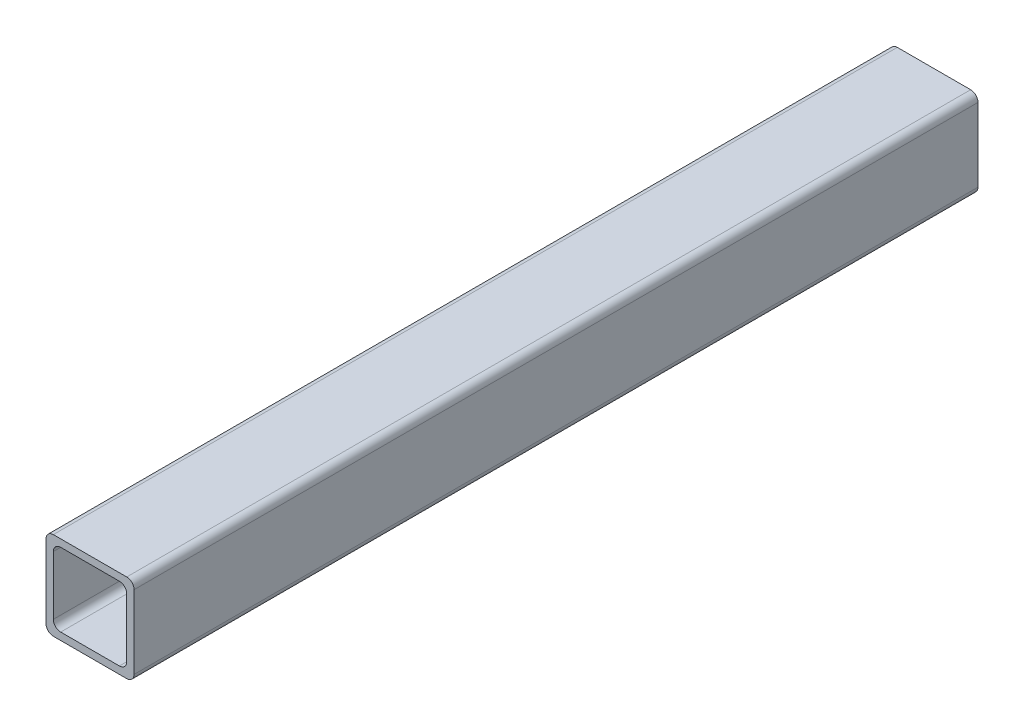
ISO-10303-21;
HEADER;
FILE_DESCRIPTION(('STEP AP214'),'2;1');
FILE_NAME('part.step','',(''),(''),'','','');
FILE_SCHEMA(('AUTOMOTIVE_DESIGN { 1 0 10303 214 1 1 1 1 }'));
ENDSEC;
DATA;
#1=APPLICATION_CONTEXT('core data for automotive mechanical design processes');
#2=APPLICATION_PROTOCOL_DEFINITION('international standard','automotive_design',2000,#1);
#3=PRODUCT_CONTEXT('',#1,'mechanical');
#4=PRODUCT('Part','Part','',(#3));
#5=PRODUCT_RELATED_PRODUCT_CATEGORY('part','',(#4));
#6=PRODUCT_DEFINITION_FORMATION('','',#4);
#7=PRODUCT_DEFINITION_CONTEXT('part definition',#1,'design');
#8=PRODUCT_DEFINITION('design','',#6,#7);
#9=PRODUCT_DEFINITION_SHAPE('','',#8);
#10=(LENGTH_UNIT() NAMED_UNIT(*) SI_UNIT(.MILLI.,.METRE.));
#11=(NAMED_UNIT(*) PLANE_ANGLE_UNIT() SI_UNIT($,.RADIAN.));
#12=(NAMED_UNIT(*) SI_UNIT($,.STERADIAN.) SOLID_ANGLE_UNIT());
#13=UNCERTAINTY_MEASURE_WITH_UNIT(LENGTH_MEASURE(1.E-05),#10,'distance_accuracy_value','');
#14=(GEOMETRIC_REPRESENTATION_CONTEXT(3) GLOBAL_UNCERTAINTY_ASSIGNED_CONTEXT((#13)) GLOBAL_UNIT_ASSIGNED_CONTEXT((#10,
#11,#12)) REPRESENTATION_CONTEXT('',''));
#15=CARTESIAN_POINT('',(0.,0.,0.));
#16=DIRECTION('',(0.,0.,1.));
#17=DIRECTION('',(1.,0.,0.));
#18=AXIS2_PLACEMENT_3D('',#15,#16,#17);
#19=CARTESIAN_POINT('',(50.,-50.,575.));
#20=DIRECTION('',(0.,0.,1.));
#21=DIRECTION('',(1.,0.,0.));
#22=AXIS2_PLACEMENT_3D('',#19,#20,#21);
#23=PLANE('',#22);
#24=CARTESIAN_POINT('',(50.,-50.,575.));
#25=DIRECTION('',(0.,0.,1.));
#26=DIRECTION('',(1.,0.,0.));
#27=AXIS2_PLACEMENT_3D('',#24,#25,#26);
#28=CIRCLE('',#27,10.);
#29=CARTESIAN_POINT('',(49.9999999999999,-60.,575.));
#30=VERTEX_POINT('',#29);
#31=CARTESIAN_POINT('',(60.,-49.9999999999999,575.));
#32=VERTEX_POINT('',#31);
#33=EDGE_CURVE('E249',#30,#32,#28,.T.);
#34=ORIENTED_EDGE('',*,*,#33,.T.);
#35=DIRECTION('',(0.,1.,0.));
#36=VECTOR('',#35,1.);
#37=CARTESIAN_POINT('',(60.,-49.9999999999999,575.));
#38=LINE('',#37,#36);
#39=CARTESIAN_POINT('',(60.,50.,575.));
#40=VERTEX_POINT('',#39);
#41=EDGE_CURVE('E253',#32,#40,#38,.T.);
#42=ORIENTED_EDGE('',*,*,#41,.T.);
#43=CARTESIAN_POINT('',(50.,50.,575.));
#44=DIRECTION('',(0.,0.,1.));
#45=DIRECTION('',(-1.,0.,0.));
#46=AXIS2_PLACEMENT_3D('',#43,#44,#45);
#47=CIRCLE('',#46,10.);
#48=CARTESIAN_POINT('',(49.9999999999999,60.,575.));
#49=VERTEX_POINT('',#48);
#50=EDGE_CURVE('E257',#40,#49,#47,.T.);
#51=ORIENTED_EDGE('',*,*,#50,.T.);
#52=DIRECTION('',(-1.,0.,0.));
#53=VECTOR('',#52,1.);
#54=CARTESIAN_POINT('',(-49.9999999999999,60.,575.));
#55=LINE('',#54,#53);
#56=CARTESIAN_POINT('',(-49.9999999999999,60.,575.));
#57=VERTEX_POINT('',#56);
#58=EDGE_CURVE('E260',#49,#57,#55,.T.);
#59=ORIENTED_EDGE('',*,*,#58,.T.);
#60=CARTESIAN_POINT('',(-50.,50.,575.));
#61=DIRECTION('',(0.,0.,1.));
#62=DIRECTION('',(-1.,0.,0.));
#63=AXIS2_PLACEMENT_3D('',#60,#61,#62);
#64=CIRCLE('',#63,10.);
#65=CARTESIAN_POINT('',(-60.,50.,575.));
#66=VERTEX_POINT('',#65);
#67=EDGE_CURVE('E263',#57,#66,#64,.T.);
#68=ORIENTED_EDGE('',*,*,#67,.T.);
#69=DIRECTION('',(0.,-1.,0.));
#70=VECTOR('',#69,1.);
#71=CARTESIAN_POINT('',(-60.,-49.9999999999999,575.));
#72=LINE('',#71,#70);
#73=CARTESIAN_POINT('',(-60.,-50.,575.));
#74=VERTEX_POINT('',#73);
#75=EDGE_CURVE('E266',#66,#74,#72,.T.);
#76=ORIENTED_EDGE('',*,*,#75,.T.);
#77=CARTESIAN_POINT('',(-50.,-50.,575.));
#78=DIRECTION('',(0.,0.,1.));
#79=DIRECTION('',(-1.,0.,0.));
#80=AXIS2_PLACEMENT_3D('',#77,#78,#79);
#81=CIRCLE('',#80,10.);
#82=CARTESIAN_POINT('',(-49.9999999999999,-60.,575.));
#83=VERTEX_POINT('',#82);
#84=EDGE_CURVE('E269',#74,#83,#81,.T.);
#85=ORIENTED_EDGE('',*,*,#84,.T.);
#86=DIRECTION('',(1.,0.,0.));
#87=VECTOR('',#86,1.);
#88=CARTESIAN_POINT('',(-49.9999999999999,-60.,575.));
#89=LINE('',#88,#87);
#90=EDGE_CURVE('E272',#83,#30,#89,.T.);
#91=ORIENTED_EDGE('',*,*,#90,.T.);
#92=EDGE_LOOP('',(#34,#42,#51,#59,#68,#76,#85,#91));
#93=FACE_BOUND('',#92,.T.);
#94=DIRECTION('',(1.,0.,0.));
#95=VECTOR('',#94,1.);
#96=CARTESIAN_POINT('',(-39.9999999999999,-50.,575.));
#97=LINE('',#96,#95);
#98=CARTESIAN_POINT('',(-39.9999999999999,-50.,575.));
#99=VERTEX_POINT('',#98);
#100=CARTESIAN_POINT('',(39.9999999999999,-50.,575.));
#101=VERTEX_POINT('',#100);
#102=EDGE_CURVE('E167',#99,#101,#97,.T.);
#103=ORIENTED_EDGE('',*,*,#102,.F.);
#104=CARTESIAN_POINT('',(-40.,-40.,575.));
#105=DIRECTION('',(0.,0.,1.));
#106=DIRECTION('',(-1.,0.,0.));
#107=AXIS2_PLACEMENT_3D('',#104,#105,#106);
#108=CIRCLE('',#107,9.99999999999999);
#109=CARTESIAN_POINT('',(-50.,-39.9999999999999,575.));
#110=VERTEX_POINT('',#109);
#111=EDGE_CURVE('E158',#110,#99,#108,.T.);
#112=ORIENTED_EDGE('',*,*,#111,.F.);
#113=DIRECTION('',(0.,-1.,0.));
#114=VECTOR('',#113,1.);
#115=CARTESIAN_POINT('',(-50.,-39.9999999999999,575.));
#116=LINE('',#115,#114);
#117=CARTESIAN_POINT('',(-50.,39.9999999999999,575.));
#118=VERTEX_POINT('',#117);
#119=EDGE_CURVE('E200',#118,#110,#116,.T.);
#120=ORIENTED_EDGE('',*,*,#119,.F.);
#121=CARTESIAN_POINT('',(-40.,40.,575.));
#122=DIRECTION('',(0.,0.,1.));
#123=DIRECTION('',(-1.,0.,0.));
#124=AXIS2_PLACEMENT_3D('',#121,#122,#123);
#125=CIRCLE('',#124,9.99999999999999);
#126=CARTESIAN_POINT('',(-39.9999999999999,50.,575.));
#127=VERTEX_POINT('',#126);
#128=EDGE_CURVE('E197',#127,#118,#125,.T.);
#129=ORIENTED_EDGE('',*,*,#128,.F.);
#130=DIRECTION('',(-1.,0.,0.));
#131=VECTOR('',#130,1.);
#132=CARTESIAN_POINT('',(-39.9999999999999,50.,575.));
#133=LINE('',#132,#131);
#134=CARTESIAN_POINT('',(39.9999999999999,50.,575.));
#135=VERTEX_POINT('',#134);
#136=EDGE_CURVE('E194',#135,#127,#133,.T.);
#137=ORIENTED_EDGE('',*,*,#136,.F.);
#138=CARTESIAN_POINT('',(40.,40.,575.));
#139=DIRECTION('',(0.,0.,1.));
#140=DIRECTION('',(-1.,0.,0.));
#141=AXIS2_PLACEMENT_3D('',#138,#139,#140);
#142=CIRCLE('',#141,9.99999999999999);
#143=CARTESIAN_POINT('',(50.,39.9999999999999,575.));
#144=VERTEX_POINT('',#143);
#145=EDGE_CURVE('E191',#144,#135,#142,.T.);
#146=ORIENTED_EDGE('',*,*,#145,.F.);
#147=DIRECTION('',(0.,1.,0.));
#148=VECTOR('',#147,1.);
#149=CARTESIAN_POINT('',(50.,-39.9999999999999,575.));
#150=LINE('',#149,#148);
#151=CARTESIAN_POINT('',(50.,-40.,575.));
#152=VERTEX_POINT('',#151);
#153=EDGE_CURVE('E185',#152,#144,#150,.T.);
#154=ORIENTED_EDGE('',*,*,#153,.F.);
#155=CARTESIAN_POINT('',(40.,-40.,575.));
#156=DIRECTION('',(0.,0.,1.));
#157=DIRECTION('',(1.,0.,0.));
#158=AXIS2_PLACEMENT_3D('',#155,#156,#157);
#159=CIRCLE('',#158,9.99999999999999);
#160=EDGE_CURVE('E181',#101,#152,#159,.T.);
#161=ORIENTED_EDGE('',*,*,#160,.F.);
#162=EDGE_LOOP('',(#103,#112,#120,#129,#137,#146,#154,#161));
#163=FACE_BOUND('',#162,.T.);
#164=ADVANCED_FACE('F44',(#93,#163),#23,.T.);
#165=CARTESIAN_POINT('',(50.,-50.,-575.));
#166=DIRECTION('',(0.,0.,1.));
#167=DIRECTION('',(1.,0.,0.));
#168=AXIS2_PLACEMENT_3D('',#165,#166,#167);
#169=PLANE('',#168);
#170=CARTESIAN_POINT('',(50.,-50.,-575.));
#171=DIRECTION('',(0.,0.,1.));
#172=DIRECTION('',(1.,0.,0.));
#173=AXIS2_PLACEMENT_3D('',#170,#171,#172);
#174=CIRCLE('',#173,10.);
#175=CARTESIAN_POINT('',(49.9999999999999,-60.,-575.));
#176=VERTEX_POINT('',#175);
#177=CARTESIAN_POINT('',(60.,-49.9999999999999,-575.));
#178=VERTEX_POINT('',#177);
#179=EDGE_CURVE('E176',#176,#178,#174,.T.);
#180=ORIENTED_EDGE('',*,*,#179,.F.);
#181=DIRECTION('',(1.,0.,0.));
#182=VECTOR('',#181,1.);
#183=CARTESIAN_POINT('',(-49.9999999999999,-60.,-575.));
#184=LINE('',#183,#182);
#185=CARTESIAN_POINT('',(-49.9999999999999,-60.,-575.));
#186=VERTEX_POINT('',#185);
#187=EDGE_CURVE('E254',#186,#176,#184,.T.);
#188=ORIENTED_EDGE('',*,*,#187,.F.);
#189=CARTESIAN_POINT('',(-50.,-50.,-575.));
#190=DIRECTION('',(0.,0.,1.));
#191=DIRECTION('',(-1.,0.,0.));
#192=AXIS2_PLACEMENT_3D('',#189,#190,#191);
#193=CIRCLE('',#192,10.);
#194=CARTESIAN_POINT('',(-60.,-50.,-575.));
#195=VERTEX_POINT('',#194);
#196=EDGE_CURVE('E294',#195,#186,#193,.T.);
#197=ORIENTED_EDGE('',*,*,#196,.F.);
#198=DIRECTION('',(0.,-1.,0.));
#199=VECTOR('',#198,1.);
#200=CARTESIAN_POINT('',(-60.,-49.9999999999999,-575.));
#201=LINE('',#200,#199);
#202=CARTESIAN_POINT('',(-60.,50.,-575.));
#203=VERTEX_POINT('',#202);
#204=EDGE_CURVE('E291',#203,#195,#201,.T.);
#205=ORIENTED_EDGE('',*,*,#204,.F.);
#206=CARTESIAN_POINT('',(-50.,50.,-575.));
#207=DIRECTION('',(0.,0.,1.));
#208=DIRECTION('',(-1.,0.,0.));
#209=AXIS2_PLACEMENT_3D('',#206,#207,#208);
#210=CIRCLE('',#209,10.);
#211=CARTESIAN_POINT('',(-49.9999999999999,60.,-575.));
#212=VERTEX_POINT('',#211);
#213=EDGE_CURVE('E288',#212,#203,#210,.T.);
#214=ORIENTED_EDGE('',*,*,#213,.F.);
#215=DIRECTION('',(-1.,0.,0.));
#216=VECTOR('',#215,1.);
#217=CARTESIAN_POINT('',(-49.9999999999999,60.,-575.));
#218=LINE('',#217,#216);
#219=CARTESIAN_POINT('',(49.9999999999999,60.,-575.));
#220=VERTEX_POINT('',#219);
#221=EDGE_CURVE('E285',#220,#212,#218,.T.);
#222=ORIENTED_EDGE('',*,*,#221,.F.);
#223=CARTESIAN_POINT('',(50.,50.,-575.));
#224=DIRECTION('',(0.,0.,1.));
#225=DIRECTION('',(-1.,0.,0.));
#226=AXIS2_PLACEMENT_3D('',#223,#224,#225);
#227=CIRCLE('',#226,10.);
#228=CARTESIAN_POINT('',(60.,50.,-575.));
#229=VERTEX_POINT('',#228);
#230=EDGE_CURVE('E282',#229,#220,#227,.T.);
#231=ORIENTED_EDGE('',*,*,#230,.F.);
#232=DIRECTION('',(0.,1.,0.));
#233=VECTOR('',#232,1.);
#234=CARTESIAN_POINT('',(60.,-49.9999999999999,-575.));
#235=LINE('',#234,#233);
#236=EDGE_CURVE('E279',#178,#229,#235,.T.);
#237=ORIENTED_EDGE('',*,*,#236,.F.);
#238=EDGE_LOOP('',(#180,#188,#197,#205,#214,#222,#231,#237));
#239=FACE_BOUND('',#238,.T.);
#240=CARTESIAN_POINT('',(-40.,-40.,-575.));
#241=DIRECTION('',(0.,0.,1.));
#242=DIRECTION('',(-1.,0.,0.));
#243=AXIS2_PLACEMENT_3D('',#240,#241,#242);
#244=CIRCLE('',#243,9.99999999999999);
#245=CARTESIAN_POINT('',(-50.,-39.9999999999999,-575.));
#246=VERTEX_POINT('',#245);
#247=CARTESIAN_POINT('',(-39.9999999999999,-50.,-575.));
#248=VERTEX_POINT('',#247);
#249=EDGE_CURVE('E68',#246,#248,#244,.T.);
#250=ORIENTED_EDGE('',*,*,#249,.T.);
#251=DIRECTION('',(1.,0.,0.));
#252=VECTOR('',#251,1.);
#253=CARTESIAN_POINT('',(-39.9999999999999,-50.,-575.));
#254=LINE('',#253,#252);
#255=CARTESIAN_POINT('',(39.9999999999999,-50.,-575.));
#256=VERTEX_POINT('',#255);
#257=EDGE_CURVE('E174',#248,#256,#254,.T.);
#258=ORIENTED_EDGE('',*,*,#257,.T.);
#259=CARTESIAN_POINT('',(40.,-40.,-575.));
#260=DIRECTION('',(0.,0.,1.));
#261=DIRECTION('',(1.,0.,0.));
#262=AXIS2_PLACEMENT_3D('',#259,#260,#261);
#263=CIRCLE('',#262,9.99999999999999);
#264=CARTESIAN_POINT('',(50.,-40.,-575.));
#265=VERTEX_POINT('',#264);
#266=EDGE_CURVE('E208',#256,#265,#263,.T.);
#267=ORIENTED_EDGE('',*,*,#266,.T.);
#268=DIRECTION('',(0.,1.,0.));
#269=VECTOR('',#268,1.);
#270=CARTESIAN_POINT('',(50.,-39.9999999999999,-575.));
#271=LINE('',#270,#269);
#272=CARTESIAN_POINT('',(50.,39.9999999999999,-575.));
#273=VERTEX_POINT('',#272);
#274=EDGE_CURVE('E212',#265,#273,#271,.T.);
#275=ORIENTED_EDGE('',*,*,#274,.T.);
#276=CARTESIAN_POINT('',(40.,40.,-575.));
#277=DIRECTION('',(0.,0.,1.));
#278=DIRECTION('',(-1.,0.,0.));
#279=AXIS2_PLACEMENT_3D('',#276,#277,#278);
#280=CIRCLE('',#279,9.99999999999999);
#281=CARTESIAN_POINT('',(39.9999999999999,50.,-575.));
#282=VERTEX_POINT('',#281);
#283=EDGE_CURVE('E216',#273,#282,#280,.T.);
#284=ORIENTED_EDGE('',*,*,#283,.T.);
#285=DIRECTION('',(-1.,0.,0.));
#286=VECTOR('',#285,1.);
#287=CARTESIAN_POINT('',(-39.9999999999999,50.,-575.));
#288=LINE('',#287,#286);
#289=CARTESIAN_POINT('',(-39.9999999999999,50.,-575.));
#290=VERTEX_POINT('',#289);
#291=EDGE_CURVE('E220',#282,#290,#288,.T.);
#292=ORIENTED_EDGE('',*,*,#291,.T.);
#293=CARTESIAN_POINT('',(-40.,40.,-575.));
#294=DIRECTION('',(0.,0.,1.));
#295=DIRECTION('',(-1.,0.,0.));
#296=AXIS2_PLACEMENT_3D('',#293,#294,#295);
#297=CIRCLE('',#296,9.99999999999999);
#298=CARTESIAN_POINT('',(-50.,39.9999999999999,-575.));
#299=VERTEX_POINT('',#298);
#300=EDGE_CURVE('E224',#290,#299,#297,.T.);
#301=ORIENTED_EDGE('',*,*,#300,.T.);
#302=DIRECTION('',(0.,-1.,0.));
#303=VECTOR('',#302,1.);
#304=CARTESIAN_POINT('',(-50.,-39.9999999999999,-575.));
#305=LINE('',#304,#303);
#306=EDGE_CURVE('E168',#299,#246,#305,.T.);
#307=ORIENTED_EDGE('',*,*,#306,.T.);
#308=EDGE_LOOP('',(#250,#258,#267,#275,#284,#292,#301,#307));
#309=FACE_BOUND('',#308,.T.);
#310=ADVANCED_FACE('F333',(#239,#309),#169,.F.);
#311=CARTESIAN_POINT('',(50.,-50.,575.));
#312=DIRECTION('',(0.,0.,-1.));
#313=DIRECTION('',(-1.,0.,0.));
#314=AXIS2_PLACEMENT_3D('',#311,#312,#313);
#315=CYLINDRICAL_SURFACE('',#314,10.);
#316=ORIENTED_EDGE('',*,*,#179,.T.);
#317=DIRECTION('',(0.,0.,-1.));
#318=VECTOR('',#317,1.);
#319=CARTESIAN_POINT('',(60.,-49.9999999999999,575.));
#320=LINE('',#319,#318);
#321=EDGE_CURVE('E11',#32,#178,#320,.T.);
#322=ORIENTED_EDGE('',*,*,#321,.F.);
#323=ORIENTED_EDGE('',*,*,#33,.F.);
#324=DIRECTION('',(0.,0.,-1.));
#325=VECTOR('',#324,1.);
#326=CARTESIAN_POINT('',(49.9999999999999,-60.,575.));
#327=LINE('',#326,#325);
#328=EDGE_CURVE('E275',#30,#176,#327,.T.);
#329=ORIENTED_EDGE('',*,*,#328,.T.);
#330=EDGE_LOOP('',(#316,#322,#323,#329));
#331=FACE_BOUND('',#330,.T.);
#332=ADVANCED_FACE('F46',(#331),#315,.T.);
#333=CARTESIAN_POINT('',(60.,-49.9999999999999,575.));
#334=DIRECTION('',(-1.,0.,0.));
#335=DIRECTION('',(0.,0.,1.));
#336=AXIS2_PLACEMENT_3D('',#333,#334,#335);
#337=PLANE('',#336);
#338=ORIENTED_EDGE('',*,*,#236,.T.);
#339=DIRECTION('',(0.,0.,-1.));
#340=VECTOR('',#339,1.);
#341=CARTESIAN_POINT('',(60.,50.,575.));
#342=LINE('',#341,#340);
#343=EDGE_CURVE('E53',#40,#229,#342,.T.);
#344=ORIENTED_EDGE('',*,*,#343,.F.);
#345=ORIENTED_EDGE('',*,*,#41,.F.);
#346=ORIENTED_EDGE('',*,*,#321,.T.);
#347=EDGE_LOOP('',(#338,#344,#345,#346));
#348=FACE_BOUND('',#347,.T.);
#349=ADVANCED_FACE('F350',(#348),#337,.F.);
#350=CARTESIAN_POINT('',(50.,50.,575.));
#351=DIRECTION('',(0.,0.,-1.));
#352=DIRECTION('',(-1.,0.,0.));
#353=AXIS2_PLACEMENT_3D('',#350,#351,#352);
#354=CYLINDRICAL_SURFACE('',#353,10.);
#355=ORIENTED_EDGE('',*,*,#230,.T.);
#356=DIRECTION('',(0.,0.,-1.));
#357=VECTOR('',#356,1.);
#358=CARTESIAN_POINT('',(49.9999999999999,60.,575.));
#359=LINE('',#358,#357);
#360=EDGE_CURVE('E318',#49,#220,#359,.T.);
#361=ORIENTED_EDGE('',*,*,#360,.F.);
#362=ORIENTED_EDGE('',*,*,#50,.F.);
#363=ORIENTED_EDGE('',*,*,#343,.T.);
#364=EDGE_LOOP('',(#355,#361,#362,#363));
#365=FACE_BOUND('',#364,.T.);
#366=ADVANCED_FACE('F327',(#365),#354,.T.);
#367=CARTESIAN_POINT('',(-49.9999999999999,60.,575.));
#368=DIRECTION('',(0.,-1.,0.));
#369=DIRECTION('',(0.,0.,-1.));
#370=AXIS2_PLACEMENT_3D('',#367,#368,#369);
#371=PLANE('',#370);
#372=ORIENTED_EDGE('',*,*,#221,.T.);
#373=DIRECTION('',(0.,0.,-1.));
#374=VECTOR('',#373,1.);
#375=CARTESIAN_POINT('',(-49.9999999999999,60.,575.));
#376=LINE('',#375,#374);
#377=EDGE_CURVE('E314',#57,#212,#376,.T.);
#378=ORIENTED_EDGE('',*,*,#377,.F.);
#379=ORIENTED_EDGE('',*,*,#58,.F.);
#380=ORIENTED_EDGE('',*,*,#360,.T.);
#381=EDGE_LOOP('',(#372,#378,#379,#380));
#382=FACE_BOUND('',#381,.T.);
#383=ADVANCED_FACE('F339',(#382),#371,.F.);
#384=CARTESIAN_POINT('',(-50.,50.,575.));
#385=DIRECTION('',(0.,0.,-1.));
#386=DIRECTION('',(-1.,0.,0.));
#387=AXIS2_PLACEMENT_3D('',#384,#385,#386);
#388=CYLINDRICAL_SURFACE('',#387,10.);
#389=ORIENTED_EDGE('',*,*,#213,.T.);
#390=DIRECTION('',(0.,0.,-1.));
#391=VECTOR('',#390,1.);
#392=CARTESIAN_POINT('',(-60.,50.,575.));
#393=LINE('',#392,#391);
#394=EDGE_CURVE('E310',#66,#203,#393,.T.);
#395=ORIENTED_EDGE('',*,*,#394,.F.);
#396=ORIENTED_EDGE('',*,*,#67,.F.);
#397=ORIENTED_EDGE('',*,*,#377,.T.);
#398=EDGE_LOOP('',(#389,#395,#396,#397));
#399=FACE_BOUND('',#398,.T.);
#400=ADVANCED_FACE('F343',(#399),#388,.T.);
#401=CARTESIAN_POINT('',(-60.,-49.9999999999999,575.));
#402=DIRECTION('',(1.,0.,0.));
#403=DIRECTION('',(0.,0.,-1.));
#404=AXIS2_PLACEMENT_3D('',#401,#402,#403);
#405=PLANE('',#404);
#406=ORIENTED_EDGE('',*,*,#204,.T.);
#407=DIRECTION('',(0.,0.,-1.));
#408=VECTOR('',#407,1.);
#409=CARTESIAN_POINT('',(-60.,-50.,575.));
#410=LINE('',#409,#408);
#411=EDGE_CURVE('E306',#74,#195,#410,.T.);
#412=ORIENTED_EDGE('',*,*,#411,.F.);
#413=ORIENTED_EDGE('',*,*,#75,.F.);
#414=ORIENTED_EDGE('',*,*,#394,.T.);
#415=EDGE_LOOP('',(#406,#412,#413,#414));
#416=FACE_BOUND('',#415,.T.);
#417=ADVANCED_FACE('F363',(#416),#405,.F.);
#418=CARTESIAN_POINT('',(-50.,-50.,575.));
#419=DIRECTION('',(0.,0.,-1.));
#420=DIRECTION('',(-1.,0.,0.));
#421=AXIS2_PLACEMENT_3D('',#418,#419,#420);
#422=CYLINDRICAL_SURFACE('',#421,10.);
#423=ORIENTED_EDGE('',*,*,#196,.T.);
#424=DIRECTION('',(0.,0.,-1.));
#425=VECTOR('',#424,1.);
#426=CARTESIAN_POINT('',(-49.9999999999999,-60.,575.));
#427=LINE('',#426,#425);
#428=EDGE_CURVE('E302',#83,#186,#427,.T.);
#429=ORIENTED_EDGE('',*,*,#428,.F.);
#430=ORIENTED_EDGE('',*,*,#84,.F.);
#431=ORIENTED_EDGE('',*,*,#411,.T.);
#432=EDGE_LOOP('',(#423,#429,#430,#431));
#433=FACE_BOUND('',#432,.T.);
#434=ADVANCED_FACE('F361',(#433),#422,.T.);
#435=CARTESIAN_POINT('',(-49.9999999999999,-60.,575.));
#436=DIRECTION('',(0.,1.,0.));
#437=DIRECTION('',(0.,0.,1.));
#438=AXIS2_PLACEMENT_3D('',#435,#436,#437);
#439=PLANE('',#438);
#440=CARTESIAN_POINT('',(-1.31838984174237E-13,-60.,501.));
#441=DIRECTION('',(0.,-1.,0.));
#442=DIRECTION('',(0.,0.,-1.));
#443=AXIS2_PLACEMENT_3D('',#440,#441,#442);
#444=CIRCLE('',#443,8.49999999999999);
#445=CARTESIAN_POINT('',(-1.31838984174237E-13,-60.,492.5));
#446=VERTEX_POINT('',#445);
#447=EDGE_CURVE('E391',#446,#446,#444,.T.);
#448=ORIENTED_EDGE('',*,*,#447,.F.);
#449=EDGE_LOOP('',(#448));
#450=FACE_BOUND('',#449,.T.);
#451=CARTESIAN_POINT('',(0.,-60.,-501.));
#452=DIRECTION('',(0.,-1.,0.));
#453=DIRECTION('',(0.,0.,1.));
#454=AXIS2_PLACEMENT_3D('',#451,#452,#453);
#455=CIRCLE('',#454,8.49999999999999);
#456=CARTESIAN_POINT('',(0.,-60.,-492.5));
#457=VERTEX_POINT('',#456);
#458=EDGE_CURVE('E394',#457,#457,#455,.T.);
#459=ORIENTED_EDGE('',*,*,#458,.F.);
#460=EDGE_LOOP('',(#459));
#461=FACE_BOUND('',#460,.T.);
#462=ORIENTED_EDGE('',*,*,#187,.T.);
#463=ORIENTED_EDGE('',*,*,#328,.F.);
#464=ORIENTED_EDGE('',*,*,#90,.F.);
#465=ORIENTED_EDGE('',*,*,#428,.T.);
#466=EDGE_LOOP('',(#462,#463,#464,#465));
#467=FACE_BOUND('',#466,.T.);
#468=ADVANCED_FACE('F356',(#450,#461,#467),#439,.F.);
#469=CARTESIAN_POINT('',(-40.,-40.,575.));
#470=DIRECTION('',(0.,0.,-1.));
#471=DIRECTION('',(-1.,0.,0.));
#472=AXIS2_PLACEMENT_3D('',#469,#470,#471);
#473=CYLINDRICAL_SURFACE('',#472,9.99999999999999);
#474=ORIENTED_EDGE('',*,*,#249,.F.);
#475=DIRECTION('',(0.,0.,-1.));
#476=VECTOR('',#475,1.);
#477=CARTESIAN_POINT('',(-50.,-39.9999999999999,575.));
#478=LINE('',#477,#476);
#479=EDGE_CURVE('E162',#110,#246,#478,.T.);
#480=ORIENTED_EDGE('',*,*,#479,.F.);
#481=ORIENTED_EDGE('',*,*,#111,.T.);
#482=DIRECTION('',(0.,0.,-1.));
#483=VECTOR('',#482,1.);
#484=CARTESIAN_POINT('',(-39.9999999999999,-50.,575.));
#485=LINE('',#484,#483);
#486=EDGE_CURVE('E161',#99,#248,#485,.T.);
#487=ORIENTED_EDGE('',*,*,#486,.T.);
#488=EDGE_LOOP('',(#474,#480,#481,#487));
#489=FACE_BOUND('',#488,.T.);
#490=ADVANCED_FACE('F160',(#489),#473,.F.);
#491=CARTESIAN_POINT('',(-39.9999999999999,-50.,575.));
#492=DIRECTION('',(0.,1.,0.));
#493=DIRECTION('',(0.,0.,1.));
#494=AXIS2_PLACEMENT_3D('',#491,#492,#493);
#495=PLANE('',#494);
#496=CARTESIAN_POINT('',(-1.31838984174237E-13,-50.,501.));
#497=DIRECTION('',(0.,-1.,0.));
#498=DIRECTION('',(0.,0.,-1.));
#499=AXIS2_PLACEMENT_3D('',#496,#497,#498);
#500=CIRCLE('',#499,8.49999999999999);
#501=CARTESIAN_POINT('',(-1.31838984174237E-13,-50.,492.5));
#502=VERTEX_POINT('',#501);
#503=EDGE_CURVE('E205',#502,#502,#500,.T.);
#504=ORIENTED_EDGE('',*,*,#503,.T.);
#505=EDGE_LOOP('',(#504));
#506=FACE_BOUND('',#505,.T.);
#507=CARTESIAN_POINT('',(0.,-50.,-501.));
#508=DIRECTION('',(0.,-1.,0.));
#509=DIRECTION('',(0.,0.,1.));
#510=AXIS2_PLACEMENT_3D('',#507,#508,#509);
#511=CIRCLE('',#510,8.49999999999999);
#512=CARTESIAN_POINT('',(0.,-50.,-492.5));
#513=VERTEX_POINT('',#512);
#514=EDGE_CURVE('E397',#513,#513,#511,.T.);
#515=ORIENTED_EDGE('',*,*,#514,.T.);
#516=EDGE_LOOP('',(#515));
#517=FACE_BOUND('',#516,.T.);
#518=ORIENTED_EDGE('',*,*,#257,.F.);
#519=ORIENTED_EDGE('',*,*,#486,.F.);
#520=ORIENTED_EDGE('',*,*,#102,.T.);
#521=DIRECTION('',(0.,0.,-1.));
#522=VECTOR('',#521,1.);
#523=CARTESIAN_POINT('',(39.9999999999999,-50.,575.));
#524=LINE('',#523,#522);
#525=EDGE_CURVE('E177',#101,#256,#524,.T.);
#526=ORIENTED_EDGE('',*,*,#525,.T.);
#527=EDGE_LOOP('',(#518,#519,#520,#526));
#528=FACE_BOUND('',#527,.T.);
#529=ADVANCED_FACE('F171',(#506,#517,#528),#495,.T.);
#530=CARTESIAN_POINT('',(40.,-40.,575.));
#531=DIRECTION('',(0.,0.,-1.));
#532=DIRECTION('',(-1.,0.,0.));
#533=AXIS2_PLACEMENT_3D('',#530,#531,#532);
#534=CYLINDRICAL_SURFACE('',#533,9.99999999999999);
#535=ORIENTED_EDGE('',*,*,#266,.F.);
#536=ORIENTED_EDGE('',*,*,#525,.F.);
#537=ORIENTED_EDGE('',*,*,#160,.T.);
#538=DIRECTION('',(0.,0.,-1.));
#539=VECTOR('',#538,1.);
#540=CARTESIAN_POINT('',(50.,-40.,575.));
#541=LINE('',#540,#539);
#542=EDGE_CURVE('E244',#152,#265,#541,.T.);
#543=ORIENTED_EDGE('',*,*,#542,.T.);
#544=EDGE_LOOP('',(#535,#536,#537,#543));
#545=FACE_BOUND('',#544,.T.);
#546=ADVANCED_FACE('F438',(#545),#534,.F.);
#547=CARTESIAN_POINT('',(50.,-39.9999999999999,575.));
#548=DIRECTION('',(-1.,0.,0.));
#549=DIRECTION('',(0.,0.,1.));
#550=AXIS2_PLACEMENT_3D('',#547,#548,#549);
#551=PLANE('',#550);
#552=ORIENTED_EDGE('',*,*,#274,.F.);
#553=ORIENTED_EDGE('',*,*,#542,.F.);
#554=ORIENTED_EDGE('',*,*,#153,.T.);
#555=DIRECTION('',(0.,0.,-1.));
#556=VECTOR('',#555,1.);
#557=CARTESIAN_POINT('',(50.,39.9999999999999,575.));
#558=LINE('',#557,#556);
#559=EDGE_CURVE('E241',#144,#273,#558,.T.);
#560=ORIENTED_EDGE('',*,*,#559,.T.);
#561=EDGE_LOOP('',(#552,#553,#554,#560));
#562=FACE_BOUND('',#561,.T.);
#563=ADVANCED_FACE('F434',(#562),#551,.T.);
#564=CARTESIAN_POINT('',(40.,40.,575.));
#565=DIRECTION('',(0.,0.,-1.));
#566=DIRECTION('',(-1.,0.,0.));
#567=AXIS2_PLACEMENT_3D('',#564,#565,#566);
#568=CYLINDRICAL_SURFACE('',#567,9.99999999999999);
#569=ORIENTED_EDGE('',*,*,#283,.F.);
#570=ORIENTED_EDGE('',*,*,#559,.F.);
#571=ORIENTED_EDGE('',*,*,#145,.T.);
#572=DIRECTION('',(0.,0.,-1.));
#573=VECTOR('',#572,1.);
#574=CARTESIAN_POINT('',(39.9999999999999,50.,575.));
#575=LINE('',#574,#573);
#576=EDGE_CURVE('E238',#135,#282,#575,.T.);
#577=ORIENTED_EDGE('',*,*,#576,.T.);
#578=EDGE_LOOP('',(#569,#570,#571,#577));
#579=FACE_BOUND('',#578,.T.);
#580=ADVANCED_FACE('F430',(#579),#568,.F.);
#581=CARTESIAN_POINT('',(-39.9999999999999,50.,575.));
#582=DIRECTION('',(0.,-1.,0.));
#583=DIRECTION('',(0.,0.,-1.));
#584=AXIS2_PLACEMENT_3D('',#581,#582,#583);
#585=PLANE('',#584);
#586=ORIENTED_EDGE('',*,*,#291,.F.);
#587=ORIENTED_EDGE('',*,*,#576,.F.);
#588=ORIENTED_EDGE('',*,*,#136,.T.);
#589=DIRECTION('',(0.,0.,-1.));
#590=VECTOR('',#589,1.);
#591=CARTESIAN_POINT('',(-39.9999999999999,50.,575.));
#592=LINE('',#591,#590);
#593=EDGE_CURVE('E235',#127,#290,#592,.T.);
#594=ORIENTED_EDGE('',*,*,#593,.T.);
#595=EDGE_LOOP('',(#586,#587,#588,#594));
#596=FACE_BOUND('',#595,.T.);
#597=ADVANCED_FACE('F426',(#596),#585,.T.);
#598=CARTESIAN_POINT('',(-40.,40.,575.));
#599=DIRECTION('',(0.,0.,-1.));
#600=DIRECTION('',(-1.,0.,0.));
#601=AXIS2_PLACEMENT_3D('',#598,#599,#600);
#602=CYLINDRICAL_SURFACE('',#601,9.99999999999999);
#603=ORIENTED_EDGE('',*,*,#300,.F.);
#604=ORIENTED_EDGE('',*,*,#593,.F.);
#605=ORIENTED_EDGE('',*,*,#128,.T.);
#606=DIRECTION('',(0.,0.,-1.));
#607=VECTOR('',#606,1.);
#608=CARTESIAN_POINT('',(-50.,39.9999999999999,575.));
#609=LINE('',#608,#607);
#610=EDGE_CURVE('E60',#118,#299,#609,.T.);
#611=ORIENTED_EDGE('',*,*,#610,.T.);
#612=EDGE_LOOP('',(#603,#604,#605,#611));
#613=FACE_BOUND('',#612,.T.);
#614=ADVANCED_FACE('F423',(#613),#602,.F.);
#615=CARTESIAN_POINT('',(-50.,-39.9999999999999,575.));
#616=DIRECTION('',(1.,0.,0.));
#617=DIRECTION('',(0.,0.,-1.));
#618=AXIS2_PLACEMENT_3D('',#615,#616,#617);
#619=PLANE('',#618);
#620=ORIENTED_EDGE('',*,*,#306,.F.);
#621=ORIENTED_EDGE('',*,*,#610,.F.);
#622=ORIENTED_EDGE('',*,*,#119,.T.);
#623=ORIENTED_EDGE('',*,*,#479,.T.);
#624=EDGE_LOOP('',(#620,#621,#622,#623));
#625=FACE_BOUND('',#624,.T.);
#626=ADVANCED_FACE('F418',(#625),#619,.T.);
#627=CARTESIAN_POINT('',(0.,-50.,-501.));
#628=DIRECTION('',(0.,-1.,0.));
#629=DIRECTION('',(0.,0.,-1.));
#630=AXIS2_PLACEMENT_3D('',#627,#628,#629);
#631=CYLINDRICAL_SURFACE('',#630,8.49999999999999);
#632=ORIENTED_EDGE('',*,*,#514,.F.);
#633=EDGE_LOOP('',(#632));
#634=FACE_BOUND('',#633,.T.);
#635=ORIENTED_EDGE('',*,*,#458,.T.);
#636=EDGE_LOOP('',(#635));
#637=FACE_BOUND('',#636,.T.);
#638=ADVANCED_FACE('F413',(#634,#637),#631,.F.);
#639=CARTESIAN_POINT('',(-1.31838984174237E-13,-50.,501.));
#640=DIRECTION('',(0.,-1.,0.));
#641=DIRECTION('',(0.,0.,-1.));
#642=AXIS2_PLACEMENT_3D('',#639,#640,#641);
#643=CYLINDRICAL_SURFACE('',#642,8.49999999999999);
#644=ORIENTED_EDGE('',*,*,#503,.F.);
#645=EDGE_LOOP('',(#644));
#646=FACE_BOUND('',#645,.T.);
#647=ORIENTED_EDGE('',*,*,#447,.T.);
#648=EDGE_LOOP('',(#647));
#649=FACE_BOUND('',#648,.T.);
#650=ADVANCED_FACE('F410',(#646,#649),#643,.F.);
#651=CLOSED_SHELL('',(#164,#310,#332,#349,#366,#383,#400,#417,#434,#468,#490,#529,#546,#563,
#580,#597,#614,#626,#638,#650));
#652=MANIFOLD_SOLID_BREP('B2',#651);
#653=ADVANCED_BREP_SHAPE_REPRESENTATION('',(#18,#652),#14);
#654=SHAPE_DEFINITION_REPRESENTATION(#9,#653);
ENDSEC;
END-ISO-10303-21;
